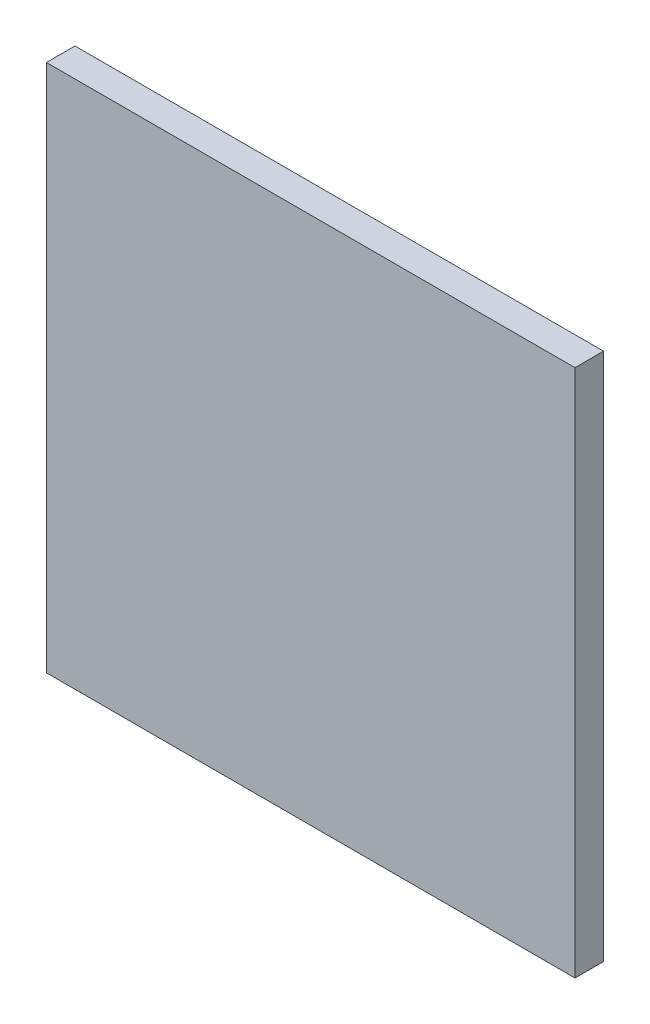
ISO-10303-21;
HEADER;
FILE_DESCRIPTION(('STEP AP214'),'2;1');
FILE_NAME('part.step','',(''),(''),'','','');
FILE_SCHEMA(('AUTOMOTIVE_DESIGN { 1 0 10303 214 1 1 1 1 }'));
ENDSEC;
DATA;
#1=APPLICATION_CONTEXT('core data for automotive mechanical design processes');
#2=APPLICATION_PROTOCOL_DEFINITION('international standard','automotive_design',2000,#1);
#3=PRODUCT_CONTEXT('',#1,'mechanical');
#4=PRODUCT('Part','Part','',(#3));
#5=PRODUCT_RELATED_PRODUCT_CATEGORY('part','',(#4));
#6=PRODUCT_DEFINITION_FORMATION('','',#4);
#7=PRODUCT_DEFINITION_CONTEXT('part definition',#1,'design');
#8=PRODUCT_DEFINITION('design','',#6,#7);
#9=PRODUCT_DEFINITION_SHAPE('','',#8);
#10=(LENGTH_UNIT() NAMED_UNIT(*) SI_UNIT(.MILLI.,.METRE.));
#11=(NAMED_UNIT(*) PLANE_ANGLE_UNIT() SI_UNIT($,.RADIAN.));
#12=(NAMED_UNIT(*) SI_UNIT($,.STERADIAN.) SOLID_ANGLE_UNIT());
#13=UNCERTAINTY_MEASURE_WITH_UNIT(LENGTH_MEASURE(1.E-05),#10,'distance_accuracy_value','');
#14=(GEOMETRIC_REPRESENTATION_CONTEXT(3) GLOBAL_UNCERTAINTY_ASSIGNED_CONTEXT((#13)) GLOBAL_UNIT_ASSIGNED_CONTEXT((#10,
#11,#12)) REPRESENTATION_CONTEXT('',''));
#15=CARTESIAN_POINT('',(0.,0.,0.));
#16=DIRECTION('',(0.,0.,1.));
#17=DIRECTION('',(1.,0.,0.));
#18=AXIS2_PLACEMENT_3D('',#15,#16,#17);
#19=CARTESIAN_POINT('',(-1.84999884,1.85000138,0.2));
#20=DIRECTION('',(0.,0.,-1.));
#21=DIRECTION('',(-1.,0.,0.));
#22=AXIS2_PLACEMENT_3D('',#19,#20,#21);
#23=PLANE('',#22);
#24=DIRECTION('',(1.,0.,0.));
#25=VECTOR('',#24,1.);
#26=CARTESIAN_POINT('',(1.85000138,1.85000138,0.2));
#27=LINE('',#26,#25);
#28=CARTESIAN_POINT('',(1.85000138,1.85000138,0.2));
#29=VERTEX_POINT('',#28);
#30=CARTESIAN_POINT('',(-1.84999884,1.85000138,0.2));
#31=VERTEX_POINT('',#30);
#32=EDGE_CURVE('E20',#29,#31,#27,.F.);
#33=ORIENTED_EDGE('',*,*,#32,.T.);
#34=DIRECTION('',(0.,1.,0.));
#35=VECTOR('',#34,1.);
#36=CARTESIAN_POINT('',(-1.84999884,1.85000138,0.2));
#37=LINE('',#36,#35);
#38=CARTESIAN_POINT('',(-1.84999884,-1.84999884,0.2));
#39=VERTEX_POINT('',#38);
#40=EDGE_CURVE('E81',#31,#39,#37,.F.);
#41=ORIENTED_EDGE('',*,*,#40,.T.);
#42=DIRECTION('',(1.,0.,0.));
#43=VECTOR('',#42,1.);
#44=CARTESIAN_POINT('',(-1.84999884,-1.84999884,0.2));
#45=LINE('',#44,#43);
#46=CARTESIAN_POINT('',(1.85000138,-1.84999884,0.2));
#47=VERTEX_POINT('',#46);
#48=EDGE_CURVE('E68',#39,#47,#45,.T.);
#49=ORIENTED_EDGE('',*,*,#48,.T.);
#50=DIRECTION('',(0.,1.,0.));
#51=VECTOR('',#50,1.);
#52=CARTESIAN_POINT('',(1.85000138,-1.84999884,0.2));
#53=LINE('',#52,#51);
#54=EDGE_CURVE('E55',#47,#29,#53,.T.);
#55=ORIENTED_EDGE('',*,*,#54,.T.);
#56=EDGE_LOOP('',(#33,#41,#49,#55));
#57=FACE_BOUND('',#56,.T.);
#58=ADVANCED_FACE('F17',(#57),#23,.F.);
#59=CARTESIAN_POINT('',(1.85000138,1.85000138,0.));
#60=DIRECTION('',(0.,-1.,0.));
#61=DIRECTION('',(0.,0.,-1.));
#62=AXIS2_PLACEMENT_3D('',#59,#60,#61);
#63=PLANE('',#62);
#64=DIRECTION('',(0.,0.,1.));
#65=VECTOR('',#64,1.);
#66=CARTESIAN_POINT('',(1.85000138,1.85000138,0.));
#67=LINE('',#66,#65);
#68=CARTESIAN_POINT('',(1.85000138,1.85000138,0.));
#69=VERTEX_POINT('',#68);
#70=EDGE_CURVE('E61',#29,#69,#67,.F.);
#71=ORIENTED_EDGE('',*,*,#70,.T.);
#72=DIRECTION('',(-1.,0.,0.));
#73=VECTOR('',#72,1.);
#74=CARTESIAN_POINT('',(-1.84999884,1.85000138,0.));
#75=LINE('',#74,#73);
#76=CARTESIAN_POINT('',(-1.84999884,1.85000138,0.));
#77=VERTEX_POINT('',#76);
#78=EDGE_CURVE('E83',#77,#69,#75,.F.);
#79=ORIENTED_EDGE('',*,*,#78,.F.);
#80=DIRECTION('',(0.,0.,-1.));
#81=VECTOR('',#80,1.);
#82=CARTESIAN_POINT('',(-1.84999884,1.85000138,0.));
#83=LINE('',#82,#81);
#84=EDGE_CURVE('E64',#77,#31,#83,.F.);
#85=ORIENTED_EDGE('',*,*,#84,.T.);
#86=ORIENTED_EDGE('',*,*,#32,.F.);
#87=EDGE_LOOP('',(#71,#79,#85,#86));
#88=FACE_BOUND('',#87,.T.);
#89=ADVANCED_FACE('F60',(#88),#63,.F.);
#90=CARTESIAN_POINT('',(1.85000138,-1.84999884,0.));
#91=DIRECTION('',(-1.,0.,0.));
#92=DIRECTION('',(0.,0.,1.));
#93=AXIS2_PLACEMENT_3D('',#90,#91,#92);
#94=PLANE('',#93);
#95=DIRECTION('',(0.,0.,1.));
#96=VECTOR('',#95,1.);
#97=CARTESIAN_POINT('',(1.85000138,-1.84999884,0.));
#98=LINE('',#97,#96);
#99=CARTESIAN_POINT('',(1.85000138,-1.84999884,0.));
#100=VERTEX_POINT('',#99);
#101=EDGE_CURVE('E70',#47,#100,#98,.F.);
#102=ORIENTED_EDGE('',*,*,#101,.T.);
#103=DIRECTION('',(0.,1.,0.));
#104=VECTOR('',#103,1.);
#105=CARTESIAN_POINT('',(1.85000138,1.85000138,0.));
#106=LINE('',#105,#104);
#107=EDGE_CURVE('E74',#69,#100,#106,.F.);
#108=ORIENTED_EDGE('',*,*,#107,.F.);
#109=ORIENTED_EDGE('',*,*,#70,.F.);
#110=ORIENTED_EDGE('',*,*,#54,.F.);
#111=EDGE_LOOP('',(#102,#108,#109,#110));
#112=FACE_BOUND('',#111,.T.);
#113=ADVANCED_FACE('F72',(#112),#94,.F.);
#114=CARTESIAN_POINT('',(-1.84999884,-1.84999884,0.));
#115=DIRECTION('',(0.,1.,0.));
#116=DIRECTION('',(0.,0.,1.));
#117=AXIS2_PLACEMENT_3D('',#114,#115,#116);
#118=PLANE('',#117);
#119=DIRECTION('',(0.,0.,-1.));
#120=VECTOR('',#119,1.);
#121=CARTESIAN_POINT('',(-1.84999884,-1.84999884,0.));
#122=LINE('',#121,#120);
#123=CARTESIAN_POINT('',(-1.84999884,-1.84999884,0.));
#124=VERTEX_POINT('',#123);
#125=EDGE_CURVE('E35',#39,#124,#122,.T.);
#126=ORIENTED_EDGE('',*,*,#125,.T.);
#127=DIRECTION('',(-1.,0.,0.));
#128=VECTOR('',#127,1.);
#129=CARTESIAN_POINT('',(-1.84999884,-1.84999884,0.));
#130=LINE('',#129,#128);
#131=EDGE_CURVE('E26',#100,#124,#130,.T.);
#132=ORIENTED_EDGE('',*,*,#131,.F.);
#133=ORIENTED_EDGE('',*,*,#101,.F.);
#134=ORIENTED_EDGE('',*,*,#48,.F.);
#135=EDGE_LOOP('',(#126,#132,#133,#134));
#136=FACE_BOUND('',#135,.T.);
#137=ADVANCED_FACE('F89',(#136),#118,.F.);
#138=CARTESIAN_POINT('',(-1.84999884,1.85000138,0.));
#139=DIRECTION('',(1.,0.,0.));
#140=DIRECTION('',(0.,0.,-1.));
#141=AXIS2_PLACEMENT_3D('',#138,#139,#140);
#142=PLANE('',#141);
#143=ORIENTED_EDGE('',*,*,#84,.F.);
#144=DIRECTION('',(0.,1.,0.));
#145=VECTOR('',#144,1.);
#146=CARTESIAN_POINT('',(-1.84999884,1.85000138,0.));
#147=LINE('',#146,#145);
#148=EDGE_CURVE('E11',#124,#77,#147,.T.);
#149=ORIENTED_EDGE('',*,*,#148,.F.);
#150=ORIENTED_EDGE('',*,*,#125,.F.);
#151=ORIENTED_EDGE('',*,*,#40,.F.);
#152=EDGE_LOOP('',(#143,#149,#150,#151));
#153=FACE_BOUND('',#152,.T.);
#154=ADVANCED_FACE('F91',(#153),#142,.F.);
#155=CARTESIAN_POINT('',(-1.84999884,1.85000138,0.));
#156=DIRECTION('',(0.,0.,-1.));
#157=DIRECTION('',(-1.,0.,0.));
#158=AXIS2_PLACEMENT_3D('',#155,#156,#157);
#159=PLANE('',#158);
#160=ORIENTED_EDGE('',*,*,#131,.T.);
#161=ORIENTED_EDGE('',*,*,#148,.T.);
#162=ORIENTED_EDGE('',*,*,#78,.T.);
#163=ORIENTED_EDGE('',*,*,#107,.T.);
#164=EDGE_LOOP('',(#160,#161,#162,#163));
#165=FACE_BOUND('',#164,.T.);
#166=ADVANCED_FACE('F88',(#165),#159,.T.);
#167=CLOSED_SHELL('',(#58,#89,#113,#137,#154,#166));
#168=MANIFOLD_SOLID_BREP('B1',#167);
#169=ADVANCED_BREP_SHAPE_REPRESENTATION('',(#18,#168),#14);
#170=SHAPE_DEFINITION_REPRESENTATION(#9,#169);
ENDSEC;
END-ISO-10303-21;
